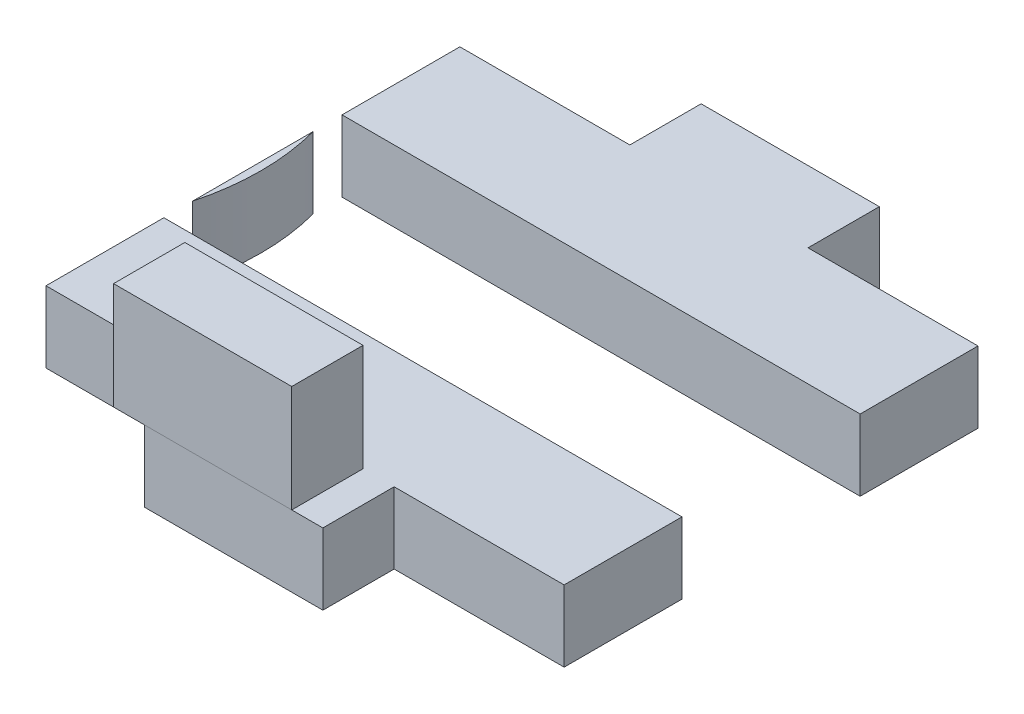
ISO-10303-21;
HEADER;
FILE_DESCRIPTION(('STEP AP214'),'2;1');
FILE_NAME('part.step','',(''),(''),'','','');
FILE_SCHEMA(('AUTOMOTIVE_DESIGN { 1 0 10303 214 1 1 1 1 }'));
ENDSEC;
DATA;
#1=APPLICATION_CONTEXT('core data for automotive mechanical design processes');
#2=APPLICATION_PROTOCOL_DEFINITION('international standard','automotive_design',2000,#1);
#3=PRODUCT_CONTEXT('',#1,'mechanical');
#4=PRODUCT('Part','Part','',(#3));
#5=PRODUCT_RELATED_PRODUCT_CATEGORY('part','',(#4));
#6=PRODUCT_DEFINITION_FORMATION('','',#4);
#7=PRODUCT_DEFINITION_CONTEXT('part definition',#1,'design');
#8=PRODUCT_DEFINITION('design','',#6,#7);
#9=PRODUCT_DEFINITION_SHAPE('','',#8);
#10=(LENGTH_UNIT() NAMED_UNIT(*) SI_UNIT(.MILLI.,.METRE.));
#11=(NAMED_UNIT(*) PLANE_ANGLE_UNIT() SI_UNIT($,.RADIAN.));
#12=(NAMED_UNIT(*) SI_UNIT($,.STERADIAN.) SOLID_ANGLE_UNIT());
#13=UNCERTAINTY_MEASURE_WITH_UNIT(LENGTH_MEASURE(1.E-05),#10,'distance_accuracy_value','');
#14=(GEOMETRIC_REPRESENTATION_CONTEXT(3) GLOBAL_UNCERTAINTY_ASSIGNED_CONTEXT((#13)) GLOBAL_UNIT_ASSIGNED_CONTEXT((#10,
#11,#12)) REPRESENTATION_CONTEXT('',''));
#15=CARTESIAN_POINT('',(0.,0.,0.));
#16=DIRECTION('',(0.,0.,1.));
#17=DIRECTION('',(1.,0.,0.));
#18=AXIS2_PLACEMENT_3D('',#15,#16,#17);
#19=CARTESIAN_POINT('',(30.5,10.,15.6138310832215));
#20=DIRECTION('',(-1.,0.,0.));
#21=DIRECTION('',(0.,0.,1.));
#22=AXIS2_PLACEMENT_3D('',#19,#20,#21);
#23=PLANE('',#22);
#24=DIRECTION('',(0.,1.,0.));
#25=VECTOR('',#24,1.);
#26=CARTESIAN_POINT('',(30.5,10.,11.6138310832215));
#27=LINE('',#26,#25);
#28=CARTESIAN_POINT('',(30.5,4.,11.6138310832215));
#29=VERTEX_POINT('',#28);
#30=CARTESIAN_POINT('',(30.5,10.,11.6138310832215));
#31=VERTEX_POINT('',#30);
#32=EDGE_CURVE('E109',#29,#31,#27,.T.);
#33=ORIENTED_EDGE('',*,*,#32,.T.);
#34=DIRECTION('',(0.,0.,-1.));
#35=VECTOR('',#34,1.);
#36=CARTESIAN_POINT('',(30.5,10.,15.6138310832215));
#37=LINE('',#36,#35);
#38=CARTESIAN_POINT('',(30.5,10.,15.6138310832215));
#39=VERTEX_POINT('',#38);
#40=EDGE_CURVE('E12',#39,#31,#37,.T.);
#41=ORIENTED_EDGE('',*,*,#40,.F.);
#42=DIRECTION('',(0.,1.,0.));
#43=VECTOR('',#42,1.);
#44=CARTESIAN_POINT('',(30.5,10.,15.6138310832215));
#45=LINE('',#44,#43);
#46=CARTESIAN_POINT('',(30.5,4.,15.6138310832215));
#47=VERTEX_POINT('',#46);
#48=EDGE_CURVE('E97',#47,#39,#45,.T.);
#49=ORIENTED_EDGE('',*,*,#48,.F.);
#50=DIRECTION('',(0.,0.,-1.));
#51=VECTOR('',#50,1.);
#52=CARTESIAN_POINT('',(30.5,4.,15.6138310832215));
#53=LINE('',#52,#51);
#54=EDGE_CURVE('E105',#47,#29,#53,.T.);
#55=ORIENTED_EDGE('',*,*,#54,.T.);
#56=EDGE_LOOP('',(#33,#41,#49,#55));
#57=FACE_BOUND('',#56,.T.);
#58=ADVANCED_FACE('F46',(#57),#23,.F.);
#59=CARTESIAN_POINT('',(20.5,10.,15.6138310832215));
#60=DIRECTION('',(0.,-1.,0.));
#61=DIRECTION('',(0.,0.,-1.));
#62=AXIS2_PLACEMENT_3D('',#59,#60,#61);
#63=PLANE('',#62);
#64=DIRECTION('',(-1.,0.,0.));
#65=VECTOR('',#64,1.);
#66=CARTESIAN_POINT('',(20.5,10.,11.6138310832215));
#67=LINE('',#66,#65);
#68=CARTESIAN_POINT('',(20.5,10.,11.6138310832215));
#69=VERTEX_POINT('',#68);
#70=EDGE_CURVE('E101',#31,#69,#67,.T.);
#71=ORIENTED_EDGE('',*,*,#70,.T.);
#72=DIRECTION('',(0.,0.,-1.));
#73=VECTOR('',#72,1.);
#74=CARTESIAN_POINT('',(20.5,10.,15.6138310832215));
#75=LINE('',#74,#73);
#76=CARTESIAN_POINT('',(20.5,10.,15.6138310832215));
#77=VERTEX_POINT('',#76);
#78=EDGE_CURVE('E54',#77,#69,#75,.T.);
#79=ORIENTED_EDGE('',*,*,#78,.F.);
#80=DIRECTION('',(-1.,0.,0.));
#81=VECTOR('',#80,1.);
#82=CARTESIAN_POINT('',(20.5,10.,15.6138310832215));
#83=LINE('',#82,#81);
#84=EDGE_CURVE('E92',#39,#77,#83,.T.);
#85=ORIENTED_EDGE('',*,*,#84,.F.);
#86=ORIENTED_EDGE('',*,*,#40,.T.);
#87=EDGE_LOOP('',(#71,#79,#85,#86));
#88=FACE_BOUND('',#87,.T.);
#89=ADVANCED_FACE('F100',(#88),#63,.F.);
#90=CARTESIAN_POINT('',(20.5,10.,15.6138310832215));
#91=DIRECTION('',(1.,0.,0.));
#92=DIRECTION('',(0.,0.,-1.));
#93=AXIS2_PLACEMENT_3D('',#90,#91,#92);
#94=PLANE('',#93);
#95=DIRECTION('',(0.,-1.,0.));
#96=VECTOR('',#95,1.);
#97=CARTESIAN_POINT('',(20.5,10.,11.6138310832215));
#98=LINE('',#97,#96);
#99=CARTESIAN_POINT('',(20.5,4.,11.6138310832215));
#100=VERTEX_POINT('',#99);
#101=EDGE_CURVE('E79',#69,#100,#98,.T.);
#102=ORIENTED_EDGE('',*,*,#101,.T.);
#103=DIRECTION('',(0.,0.,-1.));
#104=VECTOR('',#103,1.);
#105=CARTESIAN_POINT('',(20.5,4.,15.6138310832215));
#106=LINE('',#105,#104);
#107=CARTESIAN_POINT('',(20.5,4.,15.6138310832215));
#108=VERTEX_POINT('',#107);
#109=EDGE_CURVE('E102',#108,#100,#106,.T.);
#110=ORIENTED_EDGE('',*,*,#109,.F.);
#111=DIRECTION('',(0.,-1.,0.));
#112=VECTOR('',#111,1.);
#113=CARTESIAN_POINT('',(20.5,10.,15.6138310832215));
#114=LINE('',#113,#112);
#115=EDGE_CURVE('E95',#77,#108,#114,.T.);
#116=ORIENTED_EDGE('',*,*,#115,.F.);
#117=ORIENTED_EDGE('',*,*,#78,.T.);
#118=EDGE_LOOP('',(#102,#110,#116,#117));
#119=FACE_BOUND('',#118,.T.);
#120=ADVANCED_FACE('F103',(#119),#94,.F.);
#121=CARTESIAN_POINT('',(20.5,4.,15.6138310832215));
#122=DIRECTION('',(0.,1.,0.));
#123=DIRECTION('',(0.,0.,1.));
#124=AXIS2_PLACEMENT_3D('',#121,#122,#123);
#125=PLANE('',#124);
#126=DIRECTION('',(1.,0.,0.));
#127=VECTOR('',#126,1.);
#128=CARTESIAN_POINT('',(20.5,4.,11.6138310832215));
#129=LINE('',#128,#127);
#130=EDGE_CURVE('E85',#100,#29,#129,.T.);
#131=ORIENTED_EDGE('',*,*,#130,.T.);
#132=ORIENTED_EDGE('',*,*,#54,.F.);
#133=DIRECTION('',(1.,0.,0.));
#134=VECTOR('',#133,1.);
#135=CARTESIAN_POINT('',(20.5,4.,15.6138310832215));
#136=LINE('',#135,#134);
#137=EDGE_CURVE('E62',#108,#47,#136,.T.);
#138=ORIENTED_EDGE('',*,*,#137,.F.);
#139=ORIENTED_EDGE('',*,*,#109,.T.);
#140=EDGE_LOOP('',(#131,#132,#138,#139));
#141=FACE_BOUND('',#140,.T.);
#142=ADVANCED_FACE('F116',(#141),#125,.F.);
#143=CARTESIAN_POINT('',(0.,0.,15.6138310832215));
#144=DIRECTION('',(0.,0.,1.));
#145=DIRECTION('',(1.,0.,0.));
#146=AXIS2_PLACEMENT_3D('',#143,#144,#145);
#147=PLANE('',#146);
#148=ORIENTED_EDGE('',*,*,#48,.T.);
#149=ORIENTED_EDGE('',*,*,#84,.T.);
#150=ORIENTED_EDGE('',*,*,#115,.T.);
#151=ORIENTED_EDGE('',*,*,#137,.T.);
#152=EDGE_LOOP('',(#148,#149,#150,#151));
#153=FACE_BOUND('',#152,.T.);
#154=ADVANCED_FACE('F93',(#153),#147,.T.);
#155=CARTESIAN_POINT('',(0.,0.,11.6138310832215));
#156=DIRECTION('',(0.,0.,1.));
#157=DIRECTION('',(1.,0.,0.));
#158=AXIS2_PLACEMENT_3D('',#155,#156,#157);
#159=PLANE('',#158);
#160=ORIENTED_EDGE('',*,*,#32,.F.);
#161=ORIENTED_EDGE('',*,*,#130,.F.);
#162=ORIENTED_EDGE('',*,*,#101,.F.);
#163=ORIENTED_EDGE('',*,*,#70,.F.);
#164=EDGE_LOOP('',(#160,#161,#162,#163));
#165=FACE_BOUND('',#164,.T.);
#166=ADVANCED_FACE('F119',(#165),#159,.F.);
#167=CLOSED_SHELL('',(#58,#89,#120,#142,#154,#166));
#168=MANIFOLD_SOLID_BREP('B2',#167);
#169=CARTESIAN_POINT('',(0.,4.,0.));
#170=DIRECTION('',(0.,1.,0.));
#171=DIRECTION('',(0.,0.,1.));
#172=AXIS2_PLACEMENT_3D('',#169,#170,#171);
#173=PLANE('',#172);
#174=DIRECTION('',(-1.,0.,0.));
#175=VECTOR('',#174,1.);
#176=CARTESIAN_POINT('',(12.163639884695,4.,-5.));
#177=LINE('',#176,#175);
#178=CARTESIAN_POINT('',(41.7868777555258,4.,-5.));
#179=VERTEX_POINT('',#178);
#180=CARTESIAN_POINT('',(12.7081857398498,4.,-5.));
#181=VERTEX_POINT('',#180);
#182=EDGE_CURVE('E44',#179,#181,#177,.T.);
#183=ORIENTED_EDGE('',*,*,#182,.F.);
#184=DIRECTION('',(0.,0.,-1.));
#185=VECTOR('',#184,1.);
#186=CARTESIAN_POINT('',(41.7868777555258,4.,-11.6138310832215));
#187=LINE('',#186,#185);
#188=CARTESIAN_POINT('',(41.7868777555258,4.,-11.6138310832215));
#189=VERTEX_POINT('',#188);
#190=EDGE_CURVE('E266',#179,#189,#187,.T.);
#191=ORIENTED_EDGE('',*,*,#190,.T.);
#192=DIRECTION('',(-1.,0.,0.));
#193=VECTOR('',#192,1.);
#194=CARTESIAN_POINT('',(36.7868777555258,4.,-11.6138310832215));
#195=LINE('',#194,#193);
#196=CARTESIAN_POINT('',(32.2475317476878,4.,-11.6138310832215));
#197=VERTEX_POINT('',#196);
#198=EDGE_CURVE('E264',#189,#197,#195,.T.);
#199=ORIENTED_EDGE('',*,*,#198,.T.);
#200=DIRECTION('',(0.,0.,1.));
#201=VECTOR('',#200,1.);
#202=CARTESIAN_POINT('',(32.2475317476878,4.,-15.6138310832215));
#203=LINE('',#202,#201);
#204=CARTESIAN_POINT('',(32.2475317476878,4.,-15.6138310832215));
#205=VERTEX_POINT('',#204);
#206=EDGE_CURVE('E279',#205,#197,#203,.T.);
#207=ORIENTED_EDGE('',*,*,#206,.F.);
#208=DIRECTION('',(1.,0.,0.));
#209=VECTOR('',#208,1.);
#210=CARTESIAN_POINT('',(32.2475317476878,4.,-15.6138310832215));
#211=LINE('',#210,#209);
#212=CARTESIAN_POINT('',(22.2475317476878,4.,-15.6138310832215));
#213=VERTEX_POINT('',#212);
#214=EDGE_CURVE('E278',#213,#205,#211,.T.);
#215=ORIENTED_EDGE('',*,*,#214,.F.);
#216=DIRECTION('',(0.,0.,1.));
#217=VECTOR('',#216,1.);
#218=CARTESIAN_POINT('',(22.2475317476878,4.,-15.6138310832215));
#219=LINE('',#218,#217);
#220=CARTESIAN_POINT('',(22.2475317476878,4.,-11.6138310832215));
#221=VERTEX_POINT('',#220);
#222=EDGE_CURVE('E262',#213,#221,#219,.T.);
#223=ORIENTED_EDGE('',*,*,#222,.T.);
#224=CARTESIAN_POINT('',(12.7081857398498,4.,-11.6138310832215));
#225=VERTEX_POINT('',#224);
#226=EDGE_CURVE('E257',#221,#225,#195,.T.);
#227=ORIENTED_EDGE('',*,*,#226,.T.);
#228=DIRECTION('',(0.,0.,1.));
#229=VECTOR('',#228,1.);
#230=CARTESIAN_POINT('',(12.7081857398498,4.,-11.6138310832215));
#231=LINE('',#230,#229);
#232=EDGE_CURVE('E251',#225,#181,#231,.T.);
#233=ORIENTED_EDGE('',*,*,#232,.T.);
#234=EDGE_LOOP('',(#183,#191,#199,#207,#215,#223,#227,#233));
#235=FACE_BOUND('',#234,.T.);
#236=ADVANCED_FACE('F180',(#235),#173,.T.);
#237=CARTESIAN_POINT('',(0.,0.,0.));
#238=DIRECTION('',(0.,1.,0.));
#239=DIRECTION('',(0.,0.,1.));
#240=AXIS2_PLACEMENT_3D('',#237,#238,#239);
#241=PLANE('',#240);
#242=DIRECTION('',(0.,0.,-1.));
#243=VECTOR('',#242,1.);
#244=CARTESIAN_POINT('',(41.7868777555258,0.,-11.6138310832215));
#245=LINE('',#244,#243);
#246=CARTESIAN_POINT('',(41.7868777555258,0.,-5.));
#247=VERTEX_POINT('',#246);
#248=CARTESIAN_POINT('',(41.7868777555258,0.,-11.6138310832215));
#249=VERTEX_POINT('',#248);
#250=EDGE_CURVE('E183',#247,#249,#245,.T.);
#251=ORIENTED_EDGE('',*,*,#250,.F.);
#252=DIRECTION('',(-1.,0.,0.));
#253=VECTOR('',#252,1.);
#254=CARTESIAN_POINT('',(0.,0.,-5.));
#255=LINE('',#254,#253);
#256=CARTESIAN_POINT('',(12.7081857398498,0.,-5.));
#257=VERTEX_POINT('',#256);
#258=EDGE_CURVE('E201',#247,#257,#255,.T.);
#259=ORIENTED_EDGE('',*,*,#258,.T.);
#260=DIRECTION('',(0.,0.,1.));
#261=VECTOR('',#260,1.);
#262=CARTESIAN_POINT('',(12.7081857398498,0.,-11.6138310832215));
#263=LINE('',#262,#261);
#264=CARTESIAN_POINT('',(12.7081857398498,0.,-11.6138310832215));
#265=VERTEX_POINT('',#264);
#266=EDGE_CURVE('E253',#265,#257,#263,.T.);
#267=ORIENTED_EDGE('',*,*,#266,.F.);
#268=DIRECTION('',(-1.,0.,0.));
#269=VECTOR('',#268,1.);
#270=CARTESIAN_POINT('',(27.518556454203,0.,-11.6138310832215));
#271=LINE('',#270,#269);
#272=CARTESIAN_POINT('',(22.2475317476878,0.,-11.6138310832215));
#273=VERTEX_POINT('',#272);
#274=EDGE_CURVE('E300',#273,#265,#271,.T.);
#275=ORIENTED_EDGE('',*,*,#274,.F.);
#276=DIRECTION('',(0.,0.,1.));
#277=VECTOR('',#276,1.);
#278=CARTESIAN_POINT('',(22.2475317476878,0.,-15.6138310832215));
#279=LINE('',#278,#277);
#280=CARTESIAN_POINT('',(22.2475317476878,0.,-15.6138310832215));
#281=VERTEX_POINT('',#280);
#282=EDGE_CURVE('E287',#281,#273,#279,.T.);
#283=ORIENTED_EDGE('',*,*,#282,.F.);
#284=DIRECTION('',(-1.,0.,0.));
#285=VECTOR('',#284,1.);
#286=CARTESIAN_POINT('',(32.2475317476878,0.,-15.6138310832215));
#287=LINE('',#286,#285);
#288=CARTESIAN_POINT('',(32.2475317476878,0.,-15.6138310832215));
#289=VERTEX_POINT('',#288);
#290=EDGE_CURVE('E188',#289,#281,#287,.T.);
#291=ORIENTED_EDGE('',*,*,#290,.F.);
#292=DIRECTION('',(0.,0.,1.));
#293=VECTOR('',#292,1.);
#294=CARTESIAN_POINT('',(32.2475317476878,0.,-15.6138310832215));
#295=LINE('',#294,#293);
#296=CARTESIAN_POINT('',(32.2475317476878,0.,-11.6138310832215));
#297=VERTEX_POINT('',#296);
#298=EDGE_CURVE('E260',#289,#297,#295,.T.);
#299=ORIENTED_EDGE('',*,*,#298,.T.);
#300=EDGE_CURVE('E288',#249,#297,#271,.T.);
#301=ORIENTED_EDGE('',*,*,#300,.F.);
#302=EDGE_LOOP('',(#251,#259,#267,#275,#283,#291,#299,#301));
#303=FACE_BOUND('',#302,.T.);
#304=ADVANCED_FACE('F310',(#303),#241,.F.);
#305=CARTESIAN_POINT('',(41.7868777555258,4.,-11.6138310832215));
#306=DIRECTION('',(-1.,0.,0.));
#307=DIRECTION('',(0.,0.,1.));
#308=AXIS2_PLACEMENT_3D('',#305,#306,#307);
#309=PLANE('',#308);
#310=ORIENTED_EDGE('',*,*,#190,.F.);
#311=DIRECTION('',(0.,-1.,0.));
#312=VECTOR('',#311,1.);
#313=CARTESIAN_POINT('',(41.7868777555258,4.,-5.));
#314=LINE('',#313,#312);
#315=EDGE_CURVE('E195',#179,#247,#314,.T.);
#316=ORIENTED_EDGE('',*,*,#315,.T.);
#317=ORIENTED_EDGE('',*,*,#250,.T.);
#318=DIRECTION('',(0.,-1.,0.));
#319=VECTOR('',#318,1.);
#320=CARTESIAN_POINT('',(41.7868777555258,4.,-11.6138310832215));
#321=LINE('',#320,#319);
#322=EDGE_CURVE('E299',#189,#249,#321,.T.);
#323=ORIENTED_EDGE('',*,*,#322,.F.);
#324=EDGE_LOOP('',(#310,#316,#317,#323));
#325=FACE_BOUND('',#324,.T.);
#326=ADVANCED_FACE('F318',(#325),#309,.F.);
#327=CARTESIAN_POINT('',(12.7081857398498,4.,-11.6138310832215));
#328=DIRECTION('',(1.,0.,0.));
#329=DIRECTION('',(0.,0.,-1.));
#330=AXIS2_PLACEMENT_3D('',#327,#328,#329);
#331=PLANE('',#330);
#332=ORIENTED_EDGE('',*,*,#266,.T.);
#333=DIRECTION('',(0.,1.,0.));
#334=VECTOR('',#333,1.);
#335=CARTESIAN_POINT('',(12.7081857398498,4.,-5.));
#336=LINE('',#335,#334);
#337=EDGE_CURVE('E242',#257,#181,#336,.T.);
#338=ORIENTED_EDGE('',*,*,#337,.T.);
#339=ORIENTED_EDGE('',*,*,#232,.F.);
#340=DIRECTION('',(0.,-1.,0.));
#341=VECTOR('',#340,1.);
#342=CARTESIAN_POINT('',(12.7081857398498,4.,-11.6138310832215));
#343=LINE('',#342,#341);
#344=EDGE_CURVE('E254',#225,#265,#343,.T.);
#345=ORIENTED_EDGE('',*,*,#344,.T.);
#346=EDGE_LOOP('',(#332,#338,#339,#345));
#347=FACE_BOUND('',#346,.T.);
#348=ADVANCED_FACE('F249',(#347),#331,.F.);
#349=CARTESIAN_POINT('',(27.518556454203,4.,-11.6138310832215));
#350=DIRECTION('',(0.,0.,1.));
#351=DIRECTION('',(1.,0.,0.));
#352=AXIS2_PLACEMENT_3D('',#349,#350,#351);
#353=PLANE('',#352);
#354=DIRECTION('',(0.,1.,0.));
#355=VECTOR('',#354,1.);
#356=CARTESIAN_POINT('',(22.2475317476878,0.,-11.6138310832215));
#357=LINE('',#356,#355);
#358=EDGE_CURVE('E284',#273,#221,#357,.T.);
#359=ORIENTED_EDGE('',*,*,#358,.F.);
#360=ORIENTED_EDGE('',*,*,#274,.T.);
#361=ORIENTED_EDGE('',*,*,#344,.F.);
#362=ORIENTED_EDGE('',*,*,#226,.F.);
#363=EDGE_LOOP('',(#359,#360,#361,#362));
#364=FACE_BOUND('',#363,.T.);
#365=ADVANCED_FACE('F307',(#364),#353,.F.);
#366=DIRECTION('',(0.,-1.,0.));
#367=VECTOR('',#366,1.);
#368=CARTESIAN_POINT('',(32.2475317476878,0.,-11.6138310832215));
#369=LINE('',#368,#367);
#370=EDGE_CURVE('E289',#197,#297,#369,.T.);
#371=ORIENTED_EDGE('',*,*,#370,.F.);
#372=ORIENTED_EDGE('',*,*,#198,.F.);
#373=ORIENTED_EDGE('',*,*,#322,.T.);
#374=ORIENTED_EDGE('',*,*,#300,.T.);
#375=EDGE_LOOP('',(#371,#372,#373,#374));
#376=FACE_BOUND('',#375,.T.);
#377=ADVANCED_FACE('F313',(#376),#353,.F.);
#378=CARTESIAN_POINT('',(22.2475317476878,0.,-15.6138310832215));
#379=DIRECTION('',(1.,0.,0.));
#380=DIRECTION('',(0.,0.,-1.));
#381=AXIS2_PLACEMENT_3D('',#378,#379,#380);
#382=PLANE('',#381);
#383=ORIENTED_EDGE('',*,*,#358,.T.);
#384=ORIENTED_EDGE('',*,*,#222,.F.);
#385=DIRECTION('',(0.,1.,0.));
#386=VECTOR('',#385,1.);
#387=CARTESIAN_POINT('',(22.2475317476878,0.,-15.6138310832215));
#388=LINE('',#387,#386);
#389=EDGE_CURVE('E275',#281,#213,#388,.T.);
#390=ORIENTED_EDGE('',*,*,#389,.F.);
#391=ORIENTED_EDGE('',*,*,#282,.T.);
#392=EDGE_LOOP('',(#383,#384,#390,#391));
#393=FACE_BOUND('',#392,.T.);
#394=ADVANCED_FACE('F365',(#393),#382,.F.);
#395=CARTESIAN_POINT('',(32.2475317476878,0.,-15.6138310832215));
#396=DIRECTION('',(-1.,0.,0.));
#397=DIRECTION('',(0.,0.,1.));
#398=AXIS2_PLACEMENT_3D('',#395,#396,#397);
#399=PLANE('',#398);
#400=ORIENTED_EDGE('',*,*,#370,.T.);
#401=ORIENTED_EDGE('',*,*,#298,.F.);
#402=DIRECTION('',(0.,-1.,0.));
#403=VECTOR('',#402,1.);
#404=CARTESIAN_POINT('',(32.2475317476878,0.,-15.6138310832215));
#405=LINE('',#404,#403);
#406=EDGE_CURVE('E281',#205,#289,#405,.T.);
#407=ORIENTED_EDGE('',*,*,#406,.F.);
#408=ORIENTED_EDGE('',*,*,#206,.T.);
#409=EDGE_LOOP('',(#400,#401,#407,#408));
#410=FACE_BOUND('',#409,.T.);
#411=ADVANCED_FACE('F315',(#410),#399,.F.);
#412=CARTESIAN_POINT('',(0.,0.,-15.6138310832215));
#413=DIRECTION('',(0.,0.,1.));
#414=DIRECTION('',(1.,0.,0.));
#415=AXIS2_PLACEMENT_3D('',#412,#413,#414);
#416=PLANE('',#415);
#417=ORIENTED_EDGE('',*,*,#389,.T.);
#418=ORIENTED_EDGE('',*,*,#214,.T.);
#419=ORIENTED_EDGE('',*,*,#406,.T.);
#420=ORIENTED_EDGE('',*,*,#290,.T.);
#421=EDGE_LOOP('',(#417,#418,#419,#420));
#422=FACE_BOUND('',#421,.T.);
#423=ADVANCED_FACE('F385',(#422),#416,.F.);
#424=CARTESIAN_POINT('',(12.163639884695,-2.,-5.));
#425=DIRECTION('',(0.,0.,-1.));
#426=DIRECTION('',(-1.,0.,0.));
#427=AXIS2_PLACEMENT_3D('',#424,#425,#426);
#428=PLANE('',#427);
#429=ORIENTED_EDGE('',*,*,#182,.T.);
#430=ORIENTED_EDGE('',*,*,#337,.F.);
#431=ORIENTED_EDGE('',*,*,#258,.F.);
#432=ORIENTED_EDGE('',*,*,#315,.F.);
#433=EDGE_LOOP('',(#429,#430,#431,#432));
#434=FACE_BOUND('',#433,.T.);
#435=ADVANCED_FACE('F241',(#434),#428,.F.);
#436=CLOSED_SHELL('',(#236,#304,#326,#348,#365,#377,#394,#411,#423,#435));
#437=MANIFOLD_SOLID_BREP('B6',#436);
#438=CARTESIAN_POINT('',(22.2475317476878,0.,15.6138310832215));
#439=DIRECTION('',(1.,0.,0.));
#440=DIRECTION('',(0.,0.,-1.));
#441=AXIS2_PLACEMENT_3D('',#438,#439,#440);
#442=PLANE('',#441);
#443=DIRECTION('',(0.,-1.,0.));
#444=VECTOR('',#443,1.);
#445=CARTESIAN_POINT('',(22.2475317476878,0.,11.6138310832215));
#446=LINE('',#445,#444);
#447=CARTESIAN_POINT('',(22.2475317476878,4.,11.6138310832215));
#448=VERTEX_POINT('',#447);
#449=CARTESIAN_POINT('',(22.2475317476878,0.,11.6138310832215));
#450=VERTEX_POINT('',#449);
#451=EDGE_CURVE('E542',#448,#450,#446,.T.);
#452=ORIENTED_EDGE('',*,*,#451,.T.);
#453=DIRECTION('',(0.,0.,-1.));
#454=VECTOR('',#453,1.);
#455=CARTESIAN_POINT('',(22.2475317476878,0.,15.6138310832215));
#456=LINE('',#455,#454);
#457=CARTESIAN_POINT('',(22.2475317476878,0.,15.6138310832215));
#458=VERTEX_POINT('',#457);
#459=EDGE_CURVE('E518',#458,#450,#456,.T.);
#460=ORIENTED_EDGE('',*,*,#459,.F.);
#461=DIRECTION('',(0.,-1.,0.));
#462=VECTOR('',#461,1.);
#463=CARTESIAN_POINT('',(22.2475317476878,0.,15.6138310832215));
#464=LINE('',#463,#462);
#465=CARTESIAN_POINT('',(22.2475317476878,4.,15.6138310832215));
#466=VERTEX_POINT('',#465);
#467=EDGE_CURVE('E534',#466,#458,#464,.T.);
#468=ORIENTED_EDGE('',*,*,#467,.F.);
#469=DIRECTION('',(0.,0.,-1.));
#470=VECTOR('',#469,1.);
#471=CARTESIAN_POINT('',(22.2475317476878,4.,15.6138310832215));
#472=LINE('',#471,#470);
#473=EDGE_CURVE('E532',#466,#448,#472,.T.);
#474=ORIENTED_EDGE('',*,*,#473,.T.);
#475=EDGE_LOOP('',(#452,#460,#468,#474));
#476=FACE_BOUND('',#475,.T.);
#477=ADVANCED_FACE('F438',(#476),#442,.F.);
#478=CARTESIAN_POINT('',(0.,0.,15.6138310832215));
#479=DIRECTION('',(0.,0.,-1.));
#480=DIRECTION('',(-1.,0.,0.));
#481=AXIS2_PLACEMENT_3D('',#478,#479,#480);
#482=PLANE('',#481);
#483=DIRECTION('',(0.,1.,0.));
#484=VECTOR('',#483,1.);
#485=CARTESIAN_POINT('',(32.2475317476878,0.,15.6138310832215));
#486=LINE('',#485,#484);
#487=CARTESIAN_POINT('',(32.2475317476878,0.,15.6138310832215));
#488=VERTEX_POINT('',#487);
#489=CARTESIAN_POINT('',(32.2475317476878,4.,15.6138310832215));
#490=VERTEX_POINT('',#489);
#491=EDGE_CURVE('E528',#488,#490,#486,.T.);
#492=ORIENTED_EDGE('',*,*,#491,.T.);
#493=DIRECTION('',(-1.,0.,0.));
#494=VECTOR('',#493,1.);
#495=CARTESIAN_POINT('',(22.2475317476878,4.,15.6138310832215));
#496=LINE('',#495,#494);
#497=EDGE_CURVE('E531',#490,#466,#496,.T.);
#498=ORIENTED_EDGE('',*,*,#497,.T.);
#499=ORIENTED_EDGE('',*,*,#467,.T.);
#500=DIRECTION('',(1.,0.,0.));
#501=VECTOR('',#500,1.);
#502=CARTESIAN_POINT('',(22.2475317476878,0.,15.6138310832215));
#503=LINE('',#502,#501);
#504=EDGE_CURVE('E536',#458,#488,#503,.T.);
#505=ORIENTED_EDGE('',*,*,#504,.T.);
#506=EDGE_LOOP('',(#492,#498,#499,#505));
#507=FACE_BOUND('',#506,.T.);
#508=ADVANCED_FACE('F580',(#507),#482,.F.);
#509=CARTESIAN_POINT('',(32.2475317476878,0.,15.6138310832215));
#510=DIRECTION('',(-1.,0.,0.));
#511=DIRECTION('',(0.,0.,1.));
#512=AXIS2_PLACEMENT_3D('',#509,#510,#511);
#513=PLANE('',#512);
#514=DIRECTION('',(0.,1.,0.));
#515=VECTOR('',#514,1.);
#516=CARTESIAN_POINT('',(32.2475317476878,0.,11.6138310832215));
#517=LINE('',#516,#515);
#518=CARTESIAN_POINT('',(32.2475317476878,0.,11.6138310832215));
#519=VERTEX_POINT('',#518);
#520=CARTESIAN_POINT('',(32.2475317476878,4.,11.6138310832215));
#521=VERTEX_POINT('',#520);
#522=EDGE_CURVE('E538',#519,#521,#517,.T.);
#523=ORIENTED_EDGE('',*,*,#522,.T.);
#524=DIRECTION('',(0.,0.,-1.));
#525=VECTOR('',#524,1.);
#526=CARTESIAN_POINT('',(32.2475317476878,4.,15.6138310832215));
#527=LINE('',#526,#525);
#528=EDGE_CURVE('E519',#490,#521,#527,.T.);
#529=ORIENTED_EDGE('',*,*,#528,.F.);
#530=ORIENTED_EDGE('',*,*,#491,.F.);
#531=DIRECTION('',(0.,0.,-1.));
#532=VECTOR('',#531,1.);
#533=CARTESIAN_POINT('',(32.2475317476878,0.,15.6138310832215));
#534=LINE('',#533,#532);
#535=EDGE_CURVE('E541',#488,#519,#534,.T.);
#536=ORIENTED_EDGE('',*,*,#535,.T.);
#537=EDGE_LOOP('',(#523,#529,#530,#536));
#538=FACE_BOUND('',#537,.T.);
#539=ADVANCED_FACE('F582',(#538),#513,.F.);
#540=CARTESIAN_POINT('',(36.7868777555258,4.,11.6138310832215));
#541=DIRECTION('',(0.,0.,-1.));
#542=DIRECTION('',(-1.,0.,0.));
#543=AXIS2_PLACEMENT_3D('',#540,#541,#542);
#544=PLANE('',#543);
#545=ORIENTED_EDGE('',*,*,#522,.F.);
#546=DIRECTION('',(1.,0.,0.));
#547=VECTOR('',#546,1.);
#548=CARTESIAN_POINT('',(36.7868777555258,0.,11.6138310832215));
#549=LINE('',#548,#547);
#550=CARTESIAN_POINT('',(41.7868777555258,0.,11.6138310832215));
#551=VERTEX_POINT('',#550);
#552=EDGE_CURVE('E546',#519,#551,#549,.T.);
#553=ORIENTED_EDGE('',*,*,#552,.T.);
#554=DIRECTION('',(0.,-1.,0.));
#555=VECTOR('',#554,1.);
#556=CARTESIAN_POINT('',(41.7868777555258,4.,11.6138310832215));
#557=LINE('',#556,#555);
#558=CARTESIAN_POINT('',(41.7868777555258,4.,11.6138310832215));
#559=VERTEX_POINT('',#558);
#560=EDGE_CURVE('E505',#559,#551,#557,.T.);
#561=ORIENTED_EDGE('',*,*,#560,.F.);
#562=DIRECTION('',(1.,0.,0.));
#563=VECTOR('',#562,1.);
#564=CARTESIAN_POINT('',(27.518556454203,4.,11.6138310832215));
#565=LINE('',#564,#563);
#566=EDGE_CURVE('E521',#521,#559,#565,.T.);
#567=ORIENTED_EDGE('',*,*,#566,.F.);
#568=EDGE_LOOP('',(#545,#553,#561,#567));
#569=FACE_BOUND('',#568,.T.);
#570=ADVANCED_FACE('F563',(#569),#544,.F.);
#571=ORIENTED_EDGE('',*,*,#451,.F.);
#572=CARTESIAN_POINT('',(12.7081857398498,4.,11.6138310832215));
#573=VERTEX_POINT('',#572);
#574=EDGE_CURVE('E517',#573,#448,#565,.T.);
#575=ORIENTED_EDGE('',*,*,#574,.F.);
#576=DIRECTION('',(0.,-1.,0.));
#577=VECTOR('',#576,1.);
#578=CARTESIAN_POINT('',(12.7081857398498,4.,11.6138310832215));
#579=LINE('',#578,#577);
#580=CARTESIAN_POINT('',(12.7081857398498,0.,11.6138310832215));
#581=VERTEX_POINT('',#580);
#582=EDGE_CURVE('E515',#573,#581,#579,.T.);
#583=ORIENTED_EDGE('',*,*,#582,.T.);
#584=EDGE_CURVE('E555',#581,#450,#549,.T.);
#585=ORIENTED_EDGE('',*,*,#584,.T.);
#586=EDGE_LOOP('',(#571,#575,#583,#585));
#587=FACE_BOUND('',#586,.T.);
#588=ADVANCED_FACE('F573',(#587),#544,.F.);
#589=CARTESIAN_POINT('',(41.7868777555258,4.,-11.6138310832215));
#590=DIRECTION('',(-1.,0.,0.));
#591=DIRECTION('',(0.,0.,1.));
#592=AXIS2_PLACEMENT_3D('',#589,#590,#591);
#593=PLANE('',#592);
#594=DIRECTION('',(0.,0.,-1.));
#595=VECTOR('',#594,1.);
#596=CARTESIAN_POINT('',(41.7868777555258,0.,-11.6138310832215));
#597=LINE('',#596,#595);
#598=CARTESIAN_POINT('',(41.7868777555258,0.,5.));
#599=VERTEX_POINT('',#598);
#600=EDGE_CURVE('E527',#551,#599,#597,.T.);
#601=ORIENTED_EDGE('',*,*,#600,.T.);
#602=DIRECTION('',(0.,1.,0.));
#603=VECTOR('',#602,1.);
#604=CARTESIAN_POINT('',(41.7868777555258,4.,5.));
#605=LINE('',#604,#603);
#606=CARTESIAN_POINT('',(41.7868777555258,4.,5.));
#607=VERTEX_POINT('',#606);
#608=EDGE_CURVE('E456',#599,#607,#605,.T.);
#609=ORIENTED_EDGE('',*,*,#608,.T.);
#610=DIRECTION('',(0.,0.,-1.));
#611=VECTOR('',#610,1.);
#612=CARTESIAN_POINT('',(41.7868777555258,4.,-11.6138310832215));
#613=LINE('',#612,#611);
#614=EDGE_CURVE('E448',#559,#607,#613,.T.);
#615=ORIENTED_EDGE('',*,*,#614,.F.);
#616=ORIENTED_EDGE('',*,*,#560,.T.);
#617=EDGE_LOOP('',(#601,#609,#615,#616));
#618=FACE_BOUND('',#617,.T.);
#619=ADVANCED_FACE('F568',(#618),#593,.F.);
#620=CARTESIAN_POINT('',(12.7081857398498,4.,-11.6138310832215));
#621=DIRECTION('',(1.,0.,0.));
#622=DIRECTION('',(0.,0.,-1.));
#623=AXIS2_PLACEMENT_3D('',#620,#621,#622);
#624=PLANE('',#623);
#625=DIRECTION('',(0.,0.,1.));
#626=VECTOR('',#625,1.);
#627=CARTESIAN_POINT('',(12.7081857398498,4.,-11.6138310832215));
#628=LINE('',#627,#626);
#629=CARTESIAN_POINT('',(12.7081857398498,4.,5.));
#630=VERTEX_POINT('',#629);
#631=EDGE_CURVE('E510',#630,#573,#628,.T.);
#632=ORIENTED_EDGE('',*,*,#631,.F.);
#633=DIRECTION('',(0.,-1.,0.));
#634=VECTOR('',#633,1.);
#635=CARTESIAN_POINT('',(12.7081857398498,4.,5.));
#636=LINE('',#635,#634);
#637=CARTESIAN_POINT('',(12.7081857398498,0.,5.));
#638=VERTEX_POINT('',#637);
#639=EDGE_CURVE('E499',#630,#638,#636,.T.);
#640=ORIENTED_EDGE('',*,*,#639,.T.);
#641=DIRECTION('',(0.,0.,1.));
#642=VECTOR('',#641,1.);
#643=CARTESIAN_POINT('',(12.7081857398498,0.,-11.6138310832215));
#644=LINE('',#643,#642);
#645=EDGE_CURVE('E442',#638,#581,#644,.T.);
#646=ORIENTED_EDGE('',*,*,#645,.T.);
#647=ORIENTED_EDGE('',*,*,#582,.F.);
#648=EDGE_LOOP('',(#632,#640,#646,#647));
#649=FACE_BOUND('',#648,.T.);
#650=ADVANCED_FACE('F513',(#649),#624,.F.);
#651=CARTESIAN_POINT('',(0.,0.,0.));
#652=DIRECTION('',(0.,1.,0.));
#653=DIRECTION('',(0.,0.,1.));
#654=AXIS2_PLACEMENT_3D('',#651,#652,#653);
#655=PLANE('',#654);
#656=ORIENTED_EDGE('',*,*,#645,.F.);
#657=DIRECTION('',(1.,0.,0.));
#658=VECTOR('',#657,1.);
#659=CARTESIAN_POINT('',(0.,0.,5.));
#660=LINE('',#659,#658);
#661=EDGE_CURVE('E497',#638,#599,#660,.T.);
#662=ORIENTED_EDGE('',*,*,#661,.T.);
#663=ORIENTED_EDGE('',*,*,#600,.F.);
#664=ORIENTED_EDGE('',*,*,#552,.F.);
#665=ORIENTED_EDGE('',*,*,#535,.F.);
#666=ORIENTED_EDGE('',*,*,#504,.F.);
#667=ORIENTED_EDGE('',*,*,#459,.T.);
#668=ORIENTED_EDGE('',*,*,#584,.F.);
#669=EDGE_LOOP('',(#656,#662,#663,#664,#665,#666,#667,#668));
#670=FACE_BOUND('',#669,.T.);
#671=ADVANCED_FACE('F569',(#670),#655,.F.);
#672=CARTESIAN_POINT('',(0.,4.,0.));
#673=DIRECTION('',(0.,1.,0.));
#674=DIRECTION('',(0.,0.,1.));
#675=AXIS2_PLACEMENT_3D('',#672,#673,#674);
#676=PLANE('',#675);
#677=DIRECTION('',(1.,0.,0.));
#678=VECTOR('',#677,1.);
#679=CARTESIAN_POINT('',(12.163639884695,4.,5.));
#680=LINE('',#679,#678);
#681=EDGE_CURVE('E178',#630,#607,#680,.T.);
#682=ORIENTED_EDGE('',*,*,#681,.F.);
#683=ORIENTED_EDGE('',*,*,#631,.T.);
#684=ORIENTED_EDGE('',*,*,#574,.T.);
#685=ORIENTED_EDGE('',*,*,#473,.F.);
#686=ORIENTED_EDGE('',*,*,#497,.F.);
#687=ORIENTED_EDGE('',*,*,#528,.T.);
#688=ORIENTED_EDGE('',*,*,#566,.T.);
#689=ORIENTED_EDGE('',*,*,#614,.T.);
#690=EDGE_LOOP('',(#682,#683,#684,#685,#686,#687,#688,#689));
#691=FACE_BOUND('',#690,.T.);
#692=ADVANCED_FACE('F440',(#691),#676,.T.);
#693=CARTESIAN_POINT('',(12.163639884695,-2.,5.));
#694=DIRECTION('',(0.,0.,1.));
#695=DIRECTION('',(1.,0.,0.));
#696=AXIS2_PLACEMENT_3D('',#693,#694,#695);
#697=PLANE('',#696);
#698=ORIENTED_EDGE('',*,*,#661,.F.);
#699=ORIENTED_EDGE('',*,*,#639,.F.);
#700=ORIENTED_EDGE('',*,*,#681,.T.);
#701=ORIENTED_EDGE('',*,*,#608,.F.);
#702=EDGE_LOOP('',(#698,#699,#700,#701));
#703=FACE_BOUND('',#702,.T.);
#704=ADVANCED_FACE('F501',(#703),#697,.F.);
#705=CLOSED_SHELL('',(#477,#508,#539,#570,#588,#619,#650,#671,#692,#704));
#706=MANIFOLD_SOLID_BREP('B38',#705);
#707=CARTESIAN_POINT('',(12.7081857398498,4.,-11.6138310832215));
#708=DIRECTION('',(1.,0.,0.));
#709=DIRECTION('',(0.,0.,-1.));
#710=AXIS2_PLACEMENT_3D('',#707,#708,#709);
#711=PLANE('',#710);
#712=DIRECTION('',(0.,0.,1.));
#713=VECTOR('',#712,1.);
#714=CARTESIAN_POINT('',(12.7081857398498,4.,-11.6138310832215));
#715=LINE('',#714,#713);
#716=CARTESIAN_POINT('',(12.7081857398498,4.,-3.38469355274882));
#717=VERTEX_POINT('',#716);
#718=CARTESIAN_POINT('',(12.7081857398498,4.,3.38469355274882));
#719=VERTEX_POINT('',#718);
#720=EDGE_CURVE('E718',#717,#719,#715,.T.);
#721=ORIENTED_EDGE('',*,*,#720,.F.);
#722=DIRECTION('',(0.,1.,0.));
#723=VECTOR('',#722,1.);
#724=CARTESIAN_POINT('',(12.7081857398498,-2.,-3.38469355274882));
#725=LINE('',#724,#723);
#726=CARTESIAN_POINT('',(12.7081857398498,0.,-3.38469355274882));
#727=VERTEX_POINT('',#726);
#728=EDGE_CURVE('E436',#717,#727,#725,.F.);
#729=ORIENTED_EDGE('',*,*,#728,.T.);
#730=DIRECTION('',(0.,0.,1.));
#731=VECTOR('',#730,1.);
#732=CARTESIAN_POINT('',(12.7081857398498,0.,-11.6138310832215));
#733=LINE('',#732,#731);
#734=CARTESIAN_POINT('',(12.7081857398498,0.,3.38469355274882));
#735=VERTEX_POINT('',#734);
#736=EDGE_CURVE('E720',#727,#735,#733,.T.);
#737=ORIENTED_EDGE('',*,*,#736,.T.);
#738=DIRECTION('',(0.,1.,0.));
#739=VECTOR('',#738,1.);
#740=CARTESIAN_POINT('',(12.7081857398498,-2.,3.38469355274882));
#741=LINE('',#740,#739);
#742=EDGE_CURVE('E694',#735,#719,#741,.T.);
#743=ORIENTED_EDGE('',*,*,#742,.T.);
#744=EDGE_LOOP('',(#721,#729,#737,#743));
#745=FACE_BOUND('',#744,.T.);
#746=ADVANCED_FACE('F687',(#745),#711,.F.);
#747=CARTESIAN_POINT('',(0.,0.,0.));
#748=DIRECTION('',(0.,1.,0.));
#749=DIRECTION('',(0.,0.,1.));
#750=AXIS2_PLACEMENT_3D('',#747,#748,#749);
#751=PLANE('',#750);
#752=ORIENTED_EDGE('',*,*,#736,.F.);
#753=CARTESIAN_POINT('',(0.,0.,0.));
#754=DIRECTION('',(0.,1.,0.));
#755=DIRECTION('',(0.,0.,1.));
#756=AXIS2_PLACEMENT_3D('',#753,#754,#755);
#757=CIRCLE('',#756,13.151202806);
#758=EDGE_CURVE('E706',#727,#735,#757,.F.);
#759=ORIENTED_EDGE('',*,*,#758,.T.);
#760=EDGE_LOOP('',(#752,#759));
#761=FACE_BOUND('',#760,.T.);
#762=ADVANCED_FACE('F725',(#761),#751,.F.);
#763=CARTESIAN_POINT('',(0.,4.,0.));
#764=DIRECTION('',(0.,1.,0.));
#765=DIRECTION('',(0.,0.,1.));
#766=AXIS2_PLACEMENT_3D('',#763,#764,#765);
#767=PLANE('',#766);
#768=CARTESIAN_POINT('',(0.,4.,0.));
#769=DIRECTION('',(0.,-1.,0.));
#770=DIRECTION('',(0.,0.,-1.));
#771=AXIS2_PLACEMENT_3D('',#768,#769,#770);
#772=CIRCLE('',#771,13.151202806);
#773=EDGE_CURVE('E701',#717,#719,#772,.T.);
#774=ORIENTED_EDGE('',*,*,#773,.F.);
#775=ORIENTED_EDGE('',*,*,#720,.T.);
#776=EDGE_LOOP('',(#774,#775));
#777=FACE_BOUND('',#776,.T.);
#778=ADVANCED_FACE('F717',(#777),#767,.T.);
#779=CARTESIAN_POINT('',(0.,-2.,0.));
#780=DIRECTION('',(0.,1.,0.));
#781=DIRECTION('',(0.,0.,1.));
#782=AXIS2_PLACEMENT_3D('',#779,#780,#781);
#783=CYLINDRICAL_SURFACE('',#782,13.151202806);
#784=ORIENTED_EDGE('',*,*,#773,.T.);
#785=ORIENTED_EDGE('',*,*,#742,.F.);
#786=ORIENTED_EDGE('',*,*,#758,.F.);
#787=ORIENTED_EDGE('',*,*,#728,.F.);
#788=EDGE_LOOP('',(#784,#785,#786,#787));
#789=FACE_BOUND('',#788,.T.);
#790=ADVANCED_FACE('F710',(#789),#783,.T.);
#791=CLOSED_SHELL('',(#746,#762,#778,#790));
#792=MANIFOLD_SOLID_BREP('B172',#791);
#793=ADVANCED_BREP_SHAPE_REPRESENTATION('',(#18,#168,#437,#706,#792),#14);
#794=SHAPE_DEFINITION_REPRESENTATION(#9,#793);
ENDSEC;
END-ISO-10303-21;
